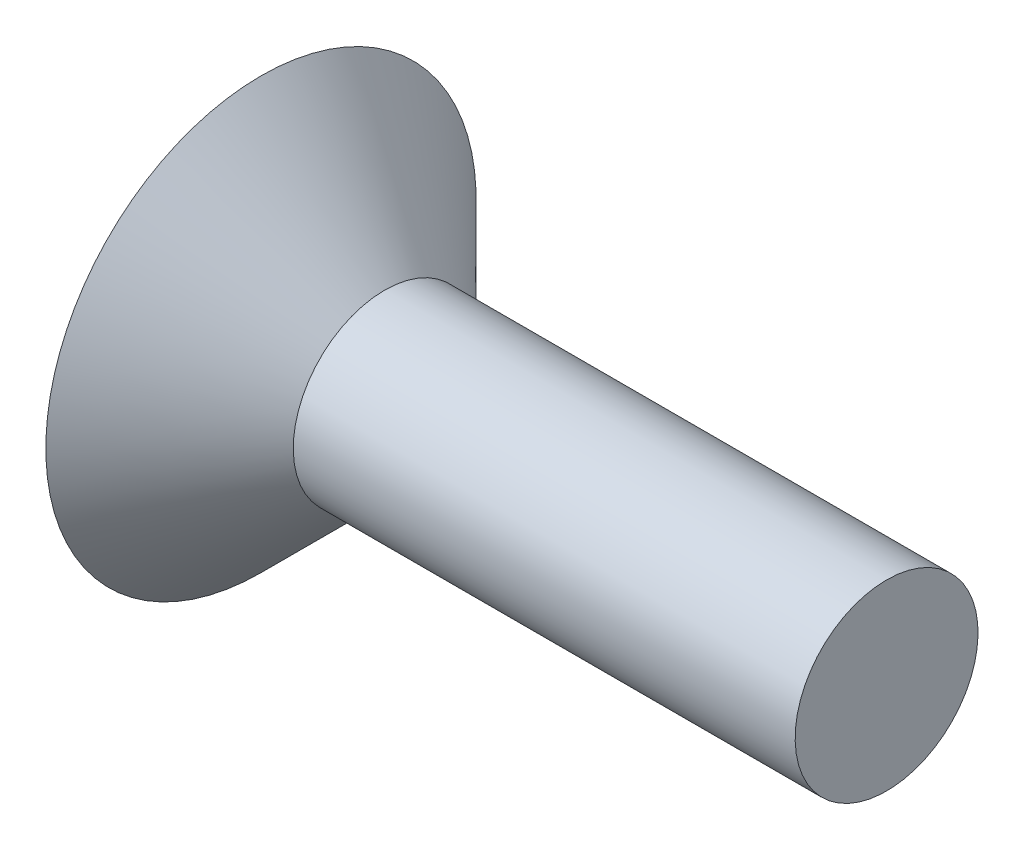
ISO-10303-21;
HEADER;
FILE_DESCRIPTION(('STEP AP214'),'2;1');
FILE_NAME('part.step','',(''),(''),'','','');
FILE_SCHEMA(('AUTOMOTIVE_DESIGN { 1 0 10303 214 1 1 1 1 }'));
ENDSEC;
DATA;
#1=APPLICATION_CONTEXT('core data for automotive mechanical design processes');
#2=APPLICATION_PROTOCOL_DEFINITION('international standard','automotive_design',2000,#1);
#3=PRODUCT_CONTEXT('',#1,'mechanical');
#4=PRODUCT('Part','Part','',(#3));
#5=PRODUCT_RELATED_PRODUCT_CATEGORY('part','',(#4));
#6=PRODUCT_DEFINITION_FORMATION('','',#4);
#7=PRODUCT_DEFINITION_CONTEXT('part definition',#1,'design');
#8=PRODUCT_DEFINITION('design','',#6,#7);
#9=PRODUCT_DEFINITION_SHAPE('','',#8);
#10=(LENGTH_UNIT() NAMED_UNIT(*) SI_UNIT(.MILLI.,.METRE.));
#11=(NAMED_UNIT(*) PLANE_ANGLE_UNIT() SI_UNIT($,.RADIAN.));
#12=(NAMED_UNIT(*) SI_UNIT($,.STERADIAN.) SOLID_ANGLE_UNIT());
#13=UNCERTAINTY_MEASURE_WITH_UNIT(LENGTH_MEASURE(1.E-05),#10,'distance_accuracy_value','');
#14=(GEOMETRIC_REPRESENTATION_CONTEXT(3) GLOBAL_UNCERTAINTY_ASSIGNED_CONTEXT((#13)) GLOBAL_UNIT_ASSIGNED_CONTEXT((#10,
#11,#12)) REPRESENTATION_CONTEXT('',''));
#15=CARTESIAN_POINT('',(0.,0.,0.));
#16=DIRECTION('',(0.,0.,1.));
#17=DIRECTION('',(1.,0.,0.));
#18=AXIS2_PLACEMENT_3D('',#15,#16,#17);
#19=CARTESIAN_POINT('',(0.,0.,0.));
#20=DIRECTION('',(-1.,0.,0.));
#21=DIRECTION('',(0.,-1.,0.));
#22=AXIS2_PLACEMENT_3D('',#19,#20,#21);
#23=PLANE('',#22);
#24=DIRECTION('',(0.,0.,1.));
#25=VECTOR('',#24,1.);
#26=CARTESIAN_POINT('',(0.,-2.,-1.15470053837925));
#27=LINE('',#26,#25);
#28=CARTESIAN_POINT('',(0.,-2.,-1.15470053837925));
#29=VERTEX_POINT('',#28);
#30=CARTESIAN_POINT('',(0.,-2.,1.15470053837925));
#31=VERTEX_POINT('',#30);
#32=EDGE_CURVE('E54',#29,#31,#27,.T.);
#33=ORIENTED_EDGE('',*,*,#32,.F.);
#34=DIRECTION('',(0.,-0.866025403784439,0.5));
#35=VECTOR('',#34,1.);
#36=CARTESIAN_POINT('',(0.,0.,-2.3094010767585));
#37=LINE('',#36,#35);
#38=CARTESIAN_POINT('',(0.,0.,-2.3094010767585));
#39=VERTEX_POINT('',#38);
#40=EDGE_CURVE('E137',#39,#29,#37,.T.);
#41=ORIENTED_EDGE('',*,*,#40,.F.);
#42=DIRECTION('',(0.,-0.866025403784439,-0.5));
#43=VECTOR('',#42,1.);
#44=CARTESIAN_POINT('',(0.,2.,-1.15470053837925));
#45=LINE('',#44,#43);
#46=CARTESIAN_POINT('',(0.,2.,-1.15470053837925));
#47=VERTEX_POINT('',#46);
#48=EDGE_CURVE('E135',#47,#39,#45,.T.);
#49=ORIENTED_EDGE('',*,*,#48,.F.);
#50=DIRECTION('',(0.,0.,-1.));
#51=VECTOR('',#50,1.);
#52=CARTESIAN_POINT('',(0.,2.,1.15470053837925));
#53=LINE('',#52,#51);
#54=CARTESIAN_POINT('',(0.,2.,1.15470053837925));
#55=VERTEX_POINT('',#54);
#56=EDGE_CURVE('E102',#55,#47,#53,.T.);
#57=ORIENTED_EDGE('',*,*,#56,.F.);
#58=DIRECTION('',(0.,0.866025403784438,-0.5));
#59=VECTOR('',#58,1.);
#60=CARTESIAN_POINT('',(0.,0.,2.3094010767585));
#61=LINE('',#60,#59);
#62=CARTESIAN_POINT('',(0.,0.,2.3094010767585));
#63=VERTEX_POINT('',#62);
#64=EDGE_CURVE('E131',#63,#55,#61,.T.);
#65=ORIENTED_EDGE('',*,*,#64,.F.);
#66=DIRECTION('',(0.,0.866025403784439,0.5));
#67=VECTOR('',#66,1.);
#68=CARTESIAN_POINT('',(0.,-2.,1.15470053837925));
#69=LINE('',#68,#67);
#70=EDGE_CURVE('E128',#31,#63,#69,.T.);
#71=ORIENTED_EDGE('',*,*,#70,.F.);
#72=EDGE_LOOP('',(#33,#41,#49,#57,#65,#71));
#73=FACE_BOUND('',#72,.T.);
#74=CARTESIAN_POINT('',(0.,0.,0.));
#75=DIRECTION('',(1.,0.,0.));
#76=DIRECTION('',(0.,1.,0.));
#77=AXIS2_PLACEMENT_3D('',#74,#75,#76);
#78=CIRCLE('',#77,4.);
#79=CARTESIAN_POINT('',(0.,4.,0.));
#80=VERTEX_POINT('',#79);
#81=EDGE_CURVE('E11',#80,#80,#78,.T.);
#82=ORIENTED_EDGE('',*,*,#81,.F.);
#83=EDGE_LOOP('',(#82));
#84=FACE_BOUND('',#83,.T.);
#85=ADVANCED_FACE('F40',(#73,#84),#23,.T.);
#86=CARTESIAN_POINT('',(2.3,0.,0.));
#87=DIRECTION('',(-1.,0.,0.));
#88=DIRECTION('',(0.,-1.,0.));
#89=AXIS2_PLACEMENT_3D('',#86,#87,#88);
#90=CONICAL_SURFACE('',#89,1.69999999999999,0.78539816339745);
#91=ORIENTED_EDGE('',*,*,#81,.T.);
#92=EDGE_LOOP('',(#91));
#93=FACE_BOUND('',#92,.T.);
#94=CARTESIAN_POINT('',(2.3,0.,0.));
#95=DIRECTION('',(1.,0.,0.));
#96=DIRECTION('',(0.,1.,0.));
#97=AXIS2_PLACEMENT_3D('',#94,#95,#96);
#98=CIRCLE('',#97,1.69999999999999);
#99=CARTESIAN_POINT('',(2.3,1.69999999999999,0.));
#100=VERTEX_POINT('',#99);
#101=EDGE_CURVE('E47',#100,#100,#98,.T.);
#102=ORIENTED_EDGE('',*,*,#101,.F.);
#103=EDGE_LOOP('',(#102));
#104=FACE_BOUND('',#103,.T.);
#105=ADVANCED_FACE('F154',(#93,#104),#90,.T.);
#106=CARTESIAN_POINT('',(11.6307735572576,0.,0.));
#107=DIRECTION('',(1.,0.,0.));
#108=DIRECTION('',(0.,1.,0.));
#109=AXIS2_PLACEMENT_3D('',#106,#107,#108);
#110=CYLINDRICAL_SURFACE('',#109,1.69999999999999);
#111=ORIENTED_EDGE('',*,*,#101,.T.);
#112=EDGE_LOOP('',(#111));
#113=FACE_BOUND('',#112,.T.);
#114=CARTESIAN_POINT('',(11.6307735572576,0.,0.));
#115=DIRECTION('',(1.,0.,0.));
#116=DIRECTION('',(0.,1.,0.));
#117=AXIS2_PLACEMENT_3D('',#114,#115,#116);
#118=CIRCLE('',#117,1.69999999999999);
#119=CARTESIAN_POINT('',(11.6307735572576,1.69999999999999,0.));
#120=VERTEX_POINT('',#119);
#121=EDGE_CURVE('E141',#120,#120,#118,.T.);
#122=ORIENTED_EDGE('',*,*,#121,.F.);
#123=EDGE_LOOP('',(#122));
#124=FACE_BOUND('',#123,.T.);
#125=ADVANCED_FACE('F151',(#113,#124),#110,.T.);
#126=CARTESIAN_POINT('',(11.6307735572576,1.69999999999999,0.));
#127=DIRECTION('',(1.,0.,0.));
#128=DIRECTION('',(0.,1.,0.));
#129=AXIS2_PLACEMENT_3D('',#126,#127,#128);
#130=PLANE('',#129);
#131=ORIENTED_EDGE('',*,*,#121,.T.);
#132=EDGE_LOOP('',(#131));
#133=FACE_BOUND('',#132,.T.);
#134=ADVANCED_FACE('F161',(#133),#130,.T.);
#135=CARTESIAN_POINT('',(1.5,-2.,-1.15470053837925));
#136=DIRECTION('',(0.,-1.,0.));
#137=DIRECTION('',(0.,0.,-1.));
#138=AXIS2_PLACEMENT_3D('',#135,#136,#137);
#139=PLANE('',#138);
#140=ORIENTED_EDGE('',*,*,#32,.T.);
#141=DIRECTION('',(-1.,0.,0.));
#142=VECTOR('',#141,1.);
#143=CARTESIAN_POINT('',(1.5,-2.,1.15470053837925));
#144=LINE('',#143,#142);
#145=CARTESIAN_POINT('',(1.5,-2.,1.15470053837925));
#146=VERTEX_POINT('',#145);
#147=EDGE_CURVE('E84',#146,#31,#144,.T.);
#148=ORIENTED_EDGE('',*,*,#147,.F.);
#149=DIRECTION('',(0.,0.,1.));
#150=VECTOR('',#149,1.);
#151=CARTESIAN_POINT('',(1.5,-2.,-1.15470053837925));
#152=LINE('',#151,#150);
#153=CARTESIAN_POINT('',(1.5,-2.,-1.15470053837925));
#154=VERTEX_POINT('',#153);
#155=EDGE_CURVE('E139',#154,#146,#152,.T.);
#156=ORIENTED_EDGE('',*,*,#155,.F.);
#157=DIRECTION('',(-1.,0.,0.));
#158=VECTOR('',#157,1.);
#159=CARTESIAN_POINT('',(1.5,-2.,-1.15470053837925));
#160=LINE('',#159,#158);
#161=EDGE_CURVE('E62',#154,#29,#160,.T.);
#162=ORIENTED_EDGE('',*,*,#161,.T.);
#163=EDGE_LOOP('',(#140,#148,#156,#162));
#164=FACE_BOUND('',#163,.T.);
#165=ADVANCED_FACE('F167',(#164),#139,.F.);
#166=CARTESIAN_POINT('',(1.5,0.,-2.3094010767585));
#167=DIRECTION('',(0.,-0.5,-0.866025403784438));
#168=DIRECTION('',(0.,0.866025403784439,-0.5));
#169=AXIS2_PLACEMENT_3D('',#166,#167,#168);
#170=PLANE('',#169);
#171=ORIENTED_EDGE('',*,*,#40,.T.);
#172=ORIENTED_EDGE('',*,*,#161,.F.);
#173=DIRECTION('',(0.,-0.866025403784439,0.5));
#174=VECTOR('',#173,1.);
#175=CARTESIAN_POINT('',(1.5,0.,-2.3094010767585));
#176=LINE('',#175,#174);
#177=CARTESIAN_POINT('',(1.5,0.,-2.3094010767585));
#178=VERTEX_POINT('',#177);
#179=EDGE_CURVE('E114',#178,#154,#176,.T.);
#180=ORIENTED_EDGE('',*,*,#179,.F.);
#181=DIRECTION('',(-1.,0.,0.));
#182=VECTOR('',#181,1.);
#183=CARTESIAN_POINT('',(1.5,0.,-2.3094010767585));
#184=LINE('',#183,#182);
#185=EDGE_CURVE('E106',#178,#39,#184,.T.);
#186=ORIENTED_EDGE('',*,*,#185,.T.);
#187=EDGE_LOOP('',(#171,#172,#180,#186));
#188=FACE_BOUND('',#187,.T.);
#189=ADVANCED_FACE('F171',(#188),#170,.F.);
#190=CARTESIAN_POINT('',(1.5,2.,-1.15470053837925));
#191=DIRECTION('',(0.,0.5,-0.866025403784438));
#192=DIRECTION('',(0.,0.866025403784439,0.5));
#193=AXIS2_PLACEMENT_3D('',#190,#191,#192);
#194=PLANE('',#193);
#195=ORIENTED_EDGE('',*,*,#48,.T.);
#196=ORIENTED_EDGE('',*,*,#185,.F.);
#197=DIRECTION('',(0.,-0.866025403784439,-0.5));
#198=VECTOR('',#197,1.);
#199=CARTESIAN_POINT('',(1.5,2.,-1.15470053837925));
#200=LINE('',#199,#198);
#201=CARTESIAN_POINT('',(1.5,2.,-1.15470053837925));
#202=VERTEX_POINT('',#201);
#203=EDGE_CURVE('E110',#202,#178,#200,.T.);
#204=ORIENTED_EDGE('',*,*,#203,.F.);
#205=DIRECTION('',(-1.,0.,0.));
#206=VECTOR('',#205,1.);
#207=CARTESIAN_POINT('',(1.5,2.,-1.15470053837925));
#208=LINE('',#207,#206);
#209=EDGE_CURVE('E95',#202,#47,#208,.T.);
#210=ORIENTED_EDGE('',*,*,#209,.T.);
#211=EDGE_LOOP('',(#195,#196,#204,#210));
#212=FACE_BOUND('',#211,.T.);
#213=ADVANCED_FACE('F111',(#212),#194,.F.);
#214=CARTESIAN_POINT('',(1.5,2.,1.15470053837925));
#215=DIRECTION('',(0.,1.,0.));
#216=DIRECTION('',(-1.,0.,0.));
#217=AXIS2_PLACEMENT_3D('',#214,#215,#216);
#218=PLANE('',#217);
#219=ORIENTED_EDGE('',*,*,#56,.T.);
#220=ORIENTED_EDGE('',*,*,#209,.F.);
#221=DIRECTION('',(0.,0.,-1.));
#222=VECTOR('',#221,1.);
#223=CARTESIAN_POINT('',(1.5,2.,1.15470053837925));
#224=LINE('',#223,#222);
#225=CARTESIAN_POINT('',(1.5,2.,1.15470053837925));
#226=VERTEX_POINT('',#225);
#227=EDGE_CURVE('E99',#226,#202,#224,.T.);
#228=ORIENTED_EDGE('',*,*,#227,.F.);
#229=DIRECTION('',(-1.,0.,0.));
#230=VECTOR('',#229,1.);
#231=CARTESIAN_POINT('',(1.5,2.,1.15470053837925));
#232=LINE('',#231,#230);
#233=EDGE_CURVE('E107',#226,#55,#232,.T.);
#234=ORIENTED_EDGE('',*,*,#233,.T.);
#235=EDGE_LOOP('',(#219,#220,#228,#234));
#236=FACE_BOUND('',#235,.T.);
#237=ADVANCED_FACE('F97',(#236),#218,.F.);
#238=CARTESIAN_POINT('',(1.5,0.,2.3094010767585));
#239=DIRECTION('',(0.,0.5,0.866025403784438));
#240=DIRECTION('',(0.,-0.866025403784439,0.5));
#241=AXIS2_PLACEMENT_3D('',#238,#239,#240);
#242=PLANE('',#241);
#243=ORIENTED_EDGE('',*,*,#64,.T.);
#244=ORIENTED_EDGE('',*,*,#233,.F.);
#245=DIRECTION('',(0.,0.866025403784438,-0.5));
#246=VECTOR('',#245,1.);
#247=CARTESIAN_POINT('',(1.5,0.,2.3094010767585));
#248=LINE('',#247,#246);
#249=CARTESIAN_POINT('',(1.5,0.,2.3094010767585));
#250=VERTEX_POINT('',#249);
#251=EDGE_CURVE('E120',#250,#226,#248,.T.);
#252=ORIENTED_EDGE('',*,*,#251,.F.);
#253=DIRECTION('',(-1.,0.,0.));
#254=VECTOR('',#253,1.);
#255=CARTESIAN_POINT('',(1.5,0.,2.3094010767585));
#256=LINE('',#255,#254);
#257=EDGE_CURVE('E144',#250,#63,#256,.T.);
#258=ORIENTED_EDGE('',*,*,#257,.T.);
#259=EDGE_LOOP('',(#243,#244,#252,#258));
#260=FACE_BOUND('',#259,.T.);
#261=ADVANCED_FACE('F175',(#260),#242,.F.);
#262=CARTESIAN_POINT('',(1.5,-2.,1.15470053837925));
#263=DIRECTION('',(0.,-0.5,0.866025403784439));
#264=DIRECTION('',(0.,-0.866025403784439,-0.5));
#265=AXIS2_PLACEMENT_3D('',#262,#263,#264);
#266=PLANE('',#265);
#267=ORIENTED_EDGE('',*,*,#70,.T.);
#268=ORIENTED_EDGE('',*,*,#257,.F.);
#269=DIRECTION('',(0.,0.866025403784439,0.5));
#270=VECTOR('',#269,1.);
#271=CARTESIAN_POINT('',(1.5,-2.,1.15470053837925));
#272=LINE('',#271,#270);
#273=EDGE_CURVE('E122',#146,#250,#272,.T.);
#274=ORIENTED_EDGE('',*,*,#273,.F.);
#275=ORIENTED_EDGE('',*,*,#147,.T.);
#276=EDGE_LOOP('',(#267,#268,#274,#275));
#277=FACE_BOUND('',#276,.T.);
#278=ADVANCED_FACE('F172',(#277),#266,.F.);
#279=CARTESIAN_POINT('',(1.5,0.,0.));
#280=DIRECTION('',(-1.,0.,0.));
#281=DIRECTION('',(0.,-1.,0.));
#282=AXIS2_PLACEMENT_3D('',#279,#280,#281);
#283=PLANE('',#282);
#284=ORIENTED_EDGE('',*,*,#155,.T.);
#285=ORIENTED_EDGE('',*,*,#273,.T.);
#286=ORIENTED_EDGE('',*,*,#251,.T.);
#287=ORIENTED_EDGE('',*,*,#227,.T.);
#288=ORIENTED_EDGE('',*,*,#203,.T.);
#289=ORIENTED_EDGE('',*,*,#179,.T.);
#290=EDGE_LOOP('',(#284,#285,#286,#287,#288,#289));
#291=FACE_BOUND('',#290,.T.);
#292=ADVANCED_FACE('F117',(#291),#283,.T.);
#293=CLOSED_SHELL('',(#85,#105,#125,#134,#165,#189,#213,#237,#261,#278,#292));
#294=MANIFOLD_SOLID_BREP('B2',#293);
#295=ADVANCED_BREP_SHAPE_REPRESENTATION('',(#18,#294),#14);
#296=SHAPE_DEFINITION_REPRESENTATION(#9,#295);
ENDSEC;
END-ISO-10303-21;
